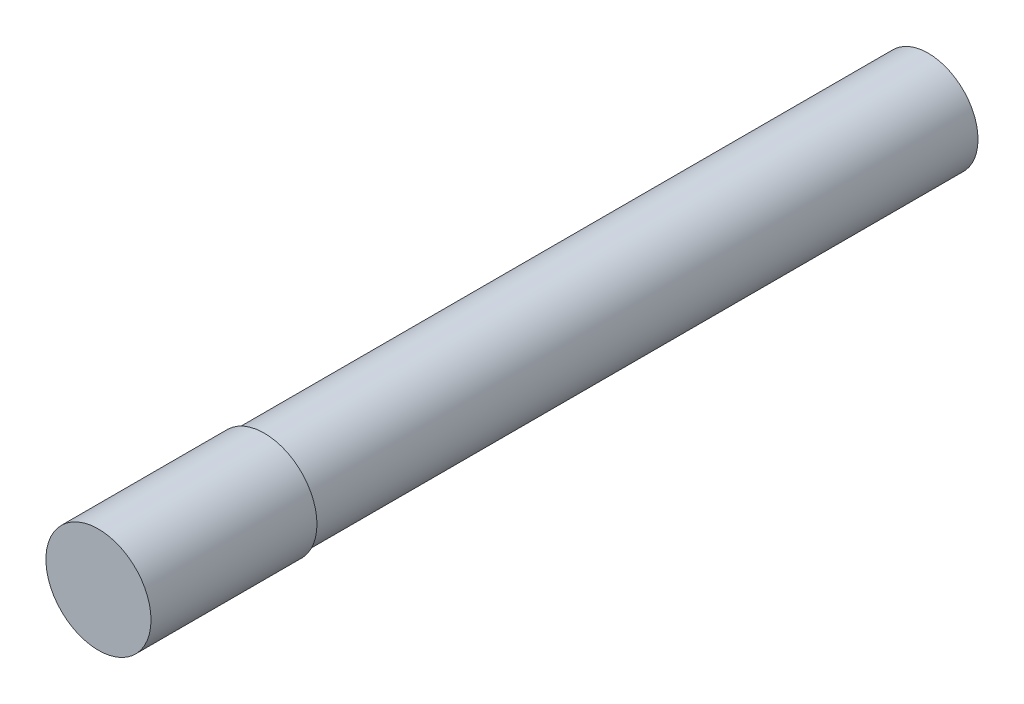
ISO-10303-21;
HEADER;
FILE_DESCRIPTION(('STEP AP214'),'2;1');
FILE_NAME('part.step','',(''),(''),'','','');
FILE_SCHEMA(('AUTOMOTIVE_DESIGN { 1 0 10303 214 1 1 1 1 }'));
ENDSEC;
DATA;
#1=APPLICATION_CONTEXT('core data for automotive mechanical design processes');
#2=APPLICATION_PROTOCOL_DEFINITION('international standard','automotive_design',2000,#1);
#3=PRODUCT_CONTEXT('',#1,'mechanical');
#4=PRODUCT('Part','Part','',(#3));
#5=PRODUCT_RELATED_PRODUCT_CATEGORY('part','',(#4));
#6=PRODUCT_DEFINITION_FORMATION('','',#4);
#7=PRODUCT_DEFINITION_CONTEXT('part definition',#1,'design');
#8=PRODUCT_DEFINITION('design','',#6,#7);
#9=PRODUCT_DEFINITION_SHAPE('','',#8);
#10=(LENGTH_UNIT() NAMED_UNIT(*) SI_UNIT(.MILLI.,.METRE.));
#11=(NAMED_UNIT(*) PLANE_ANGLE_UNIT() SI_UNIT($,.RADIAN.));
#12=(NAMED_UNIT(*) SI_UNIT($,.STERADIAN.) SOLID_ANGLE_UNIT());
#13=UNCERTAINTY_MEASURE_WITH_UNIT(LENGTH_MEASURE(1.E-05),#10,'distance_accuracy_value','');
#14=(GEOMETRIC_REPRESENTATION_CONTEXT(3) GLOBAL_UNCERTAINTY_ASSIGNED_CONTEXT((#13)) GLOBAL_UNIT_ASSIGNED_CONTEXT((#10,
#11,#12)) REPRESENTATION_CONTEXT('',''));
#15=CARTESIAN_POINT('',(0.,0.,0.));
#16=DIRECTION('',(0.,0.,1.));
#17=DIRECTION('',(1.,0.,0.));
#18=AXIS2_PLACEMENT_3D('',#15,#16,#17);
#19=CARTESIAN_POINT('',(0.,0.,120.));
#20=DIRECTION('',(0.,0.,-1.));
#21=DIRECTION('',(-1.,0.,0.));
#22=AXIS2_PLACEMENT_3D('',#19,#20,#21);
#23=CYLINDRICAL_SURFACE('',#22,9.);
#24=CARTESIAN_POINT('',(0.,0.,120.));
#25=DIRECTION('',(0.,0.,1.));
#26=DIRECTION('',(1.,0.,0.));
#27=AXIS2_PLACEMENT_3D('',#24,#25,#26);
#28=CIRCLE('',#27,9.);
#29=CARTESIAN_POINT('',(9.,0.,120.));
#30=VERTEX_POINT('',#29);
#31=EDGE_CURVE('E10',#30,#30,#28,.T.);
#32=ORIENTED_EDGE('',*,*,#31,.F.);
#33=EDGE_LOOP('',(#32));
#34=FACE_BOUND('',#33,.T.);
#35=CARTESIAN_POINT('',(0.,0.,0.));
#36=DIRECTION('',(0.,0.,1.));
#37=DIRECTION('',(1.,0.,0.));
#38=AXIS2_PLACEMENT_3D('',#35,#36,#37);
#39=CIRCLE('',#38,9.);
#40=CARTESIAN_POINT('',(9.,0.,0.));
#41=VERTEX_POINT('',#40);
#42=EDGE_CURVE('E37',#41,#41,#39,.T.);
#43=ORIENTED_EDGE('',*,*,#42,.T.);
#44=EDGE_LOOP('',(#43));
#45=FACE_BOUND('',#44,.T.);
#46=ADVANCED_FACE('F40',(#34,#45),#23,.T.);
#47=CARTESIAN_POINT('',(0.,0.,0.));
#48=DIRECTION('',(0.,0.,1.));
#49=DIRECTION('',(1.,0.,0.));
#50=AXIS2_PLACEMENT_3D('',#47,#48,#49);
#51=PLANE('',#50);
#52=ORIENTED_EDGE('',*,*,#42,.F.);
#53=EDGE_LOOP('',(#52));
#54=FACE_BOUND('',#53,.T.);
#55=ADVANCED_FACE('F58',(#54),#51,.F.);
#56=CARTESIAN_POINT('',(0.,0.,150.));
#57=DIRECTION('',(0.,0.,-1.));
#58=DIRECTION('',(-1.,0.,0.));
#59=AXIS2_PLACEMENT_3D('',#56,#57,#58);
#60=CYLINDRICAL_SURFACE('',#59,9.5);
#61=CARTESIAN_POINT('',(0.,0.,150.));
#62=DIRECTION('',(0.,0.,1.));
#63=DIRECTION('',(1.,0.,0.));
#64=AXIS2_PLACEMENT_3D('',#61,#62,#63);
#65=CIRCLE('',#64,9.5);
#66=CARTESIAN_POINT('',(9.5,0.,150.));
#67=VERTEX_POINT('',#66);
#68=EDGE_CURVE('E50',#67,#67,#65,.T.);
#69=ORIENTED_EDGE('',*,*,#68,.F.);
#70=EDGE_LOOP('',(#69));
#71=FACE_BOUND('',#70,.T.);
#72=CARTESIAN_POINT('',(0.,0.,120.));
#73=DIRECTION('',(0.,0.,1.));
#74=DIRECTION('',(1.,0.,0.));
#75=AXIS2_PLACEMENT_3D('',#72,#73,#74);
#76=CIRCLE('',#75,9.5);
#77=CARTESIAN_POINT('',(9.5,0.,120.));
#78=VERTEX_POINT('',#77);
#79=EDGE_CURVE('E47',#78,#78,#76,.T.);
#80=ORIENTED_EDGE('',*,*,#79,.T.);
#81=EDGE_LOOP('',(#80));
#82=FACE_BOUND('',#81,.T.);
#83=ADVANCED_FACE('F60',(#71,#82),#60,.T.);
#84=CARTESIAN_POINT('',(0.,0.,150.));
#85=DIRECTION('',(0.,0.,1.));
#86=DIRECTION('',(1.,0.,0.));
#87=AXIS2_PLACEMENT_3D('',#84,#85,#86);
#88=PLANE('',#87);
#89=ORIENTED_EDGE('',*,*,#68,.T.);
#90=EDGE_LOOP('',(#89));
#91=FACE_BOUND('',#90,.T.);
#92=ADVANCED_FACE('F54',(#91),#88,.T.);
#93=CARTESIAN_POINT('',(0.,0.,120.));
#94=DIRECTION('',(0.,0.,1.));
#95=DIRECTION('',(1.,0.,0.));
#96=AXIS2_PLACEMENT_3D('',#93,#94,#95);
#97=PLANE('',#96);
#98=ORIENTED_EDGE('',*,*,#31,.T.);
#99=EDGE_LOOP('',(#98));
#100=FACE_BOUND('',#99,.T.);
#101=ORIENTED_EDGE('',*,*,#79,.F.);
#102=EDGE_LOOP('',(#101));
#103=FACE_BOUND('',#102,.T.);
#104=ADVANCED_FACE('F61',(#100,#103),#97,.F.);
#105=CLOSED_SHELL('',(#46,#55,#83,#92,#104));
#106=MANIFOLD_SOLID_BREP('B2',#105);
#107=ADVANCED_BREP_SHAPE_REPRESENTATION('',(#18,#106),#14);
#108=SHAPE_DEFINITION_REPRESENTATION(#9,#107);
ENDSEC;
END-ISO-10303-21;
